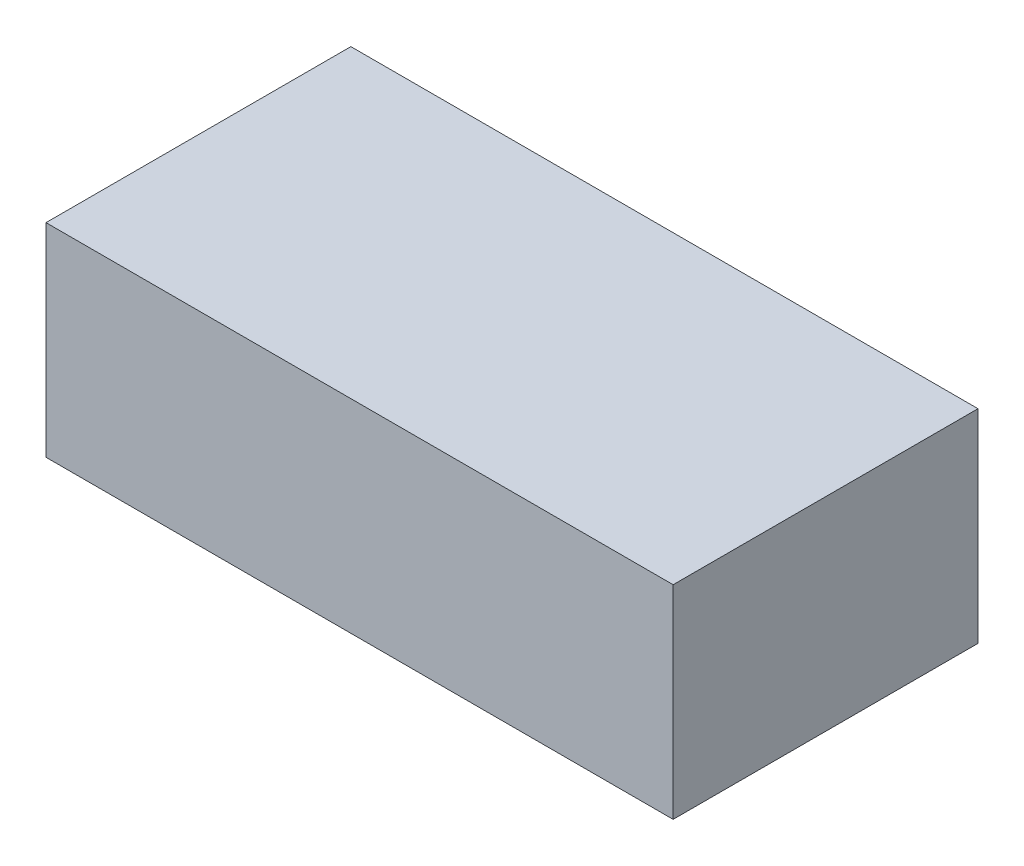
ISO-10303-21;
HEADER;
FILE_DESCRIPTION(('STEP AP214'),'2;1');
FILE_NAME('part.step','',(''),(''),'','','');
FILE_SCHEMA(('AUTOMOTIVE_DESIGN { 1 0 10303 214 1 1 1 1 }'));
ENDSEC;
DATA;
#1=APPLICATION_CONTEXT('core data for automotive mechanical design processes');
#2=APPLICATION_PROTOCOL_DEFINITION('international standard','automotive_design',2000,#1);
#3=PRODUCT_CONTEXT('',#1,'mechanical');
#4=PRODUCT('Part','Part','',(#3));
#5=PRODUCT_RELATED_PRODUCT_CATEGORY('part','',(#4));
#6=PRODUCT_DEFINITION_FORMATION('','',#4);
#7=PRODUCT_DEFINITION_CONTEXT('part definition',#1,'design');
#8=PRODUCT_DEFINITION('design','',#6,#7);
#9=PRODUCT_DEFINITION_SHAPE('','',#8);
#10=(LENGTH_UNIT() NAMED_UNIT(*) SI_UNIT(.MILLI.,.METRE.));
#11=(NAMED_UNIT(*) PLANE_ANGLE_UNIT() SI_UNIT($,.RADIAN.));
#12=(NAMED_UNIT(*) SI_UNIT($,.STERADIAN.) SOLID_ANGLE_UNIT());
#13=UNCERTAINTY_MEASURE_WITH_UNIT(LENGTH_MEASURE(1.E-05),#10,'distance_accuracy_value','');
#14=(GEOMETRIC_REPRESENTATION_CONTEXT(3) GLOBAL_UNCERTAINTY_ASSIGNED_CONTEXT((#13)) GLOBAL_UNIT_ASSIGNED_CONTEXT((#10,
#11,#12)) REPRESENTATION_CONTEXT('',''));
#15=CARTESIAN_POINT('',(0.,0.,0.));
#16=DIRECTION('',(0.,0.,1.));
#17=DIRECTION('',(1.,0.,0.));
#18=AXIS2_PLACEMENT_3D('',#15,#16,#17);
#19=CARTESIAN_POINT('',(35.,93.,-27.));
#20=DIRECTION('',(0.,1.,0.));
#21=DIRECTION('',(0.,0.,-1.));
#22=AXIS2_PLACEMENT_3D('',#19,#20,#21);
#23=PLANE('',#22);
#24=DIRECTION('',(1.,0.,0.));
#25=VECTOR('',#24,1.);
#26=CARTESIAN_POINT('',(13.4,93.,-16.5));
#27=LINE('',#26,#25);
#28=CARTESIAN_POINT('',(13.4,93.,-16.5));
#29=VERTEX_POINT('',#28);
#30=CARTESIAN_POINT('',(56.6,93.,-16.5));
#31=VERTEX_POINT('',#30);
#32=EDGE_CURVE('E85',#29,#31,#27,.T.);
#33=ORIENTED_EDGE('',*,*,#32,.T.);
#34=DIRECTION('',(0.,0.,-1.));
#35=VECTOR('',#34,1.);
#36=CARTESIAN_POINT('',(56.6,93.,-16.5));
#37=LINE('',#36,#35);
#38=CARTESIAN_POINT('',(56.6,93.,-37.5));
#39=VERTEX_POINT('',#38);
#40=EDGE_CURVE('E97',#31,#39,#37,.T.);
#41=ORIENTED_EDGE('',*,*,#40,.T.);
#42=DIRECTION('',(-1.,0.,0.));
#43=VECTOR('',#42,1.);
#44=CARTESIAN_POINT('',(56.6,93.,-37.5));
#45=LINE('',#44,#43);
#46=CARTESIAN_POINT('',(13.4,93.,-37.5));
#47=VERTEX_POINT('',#46);
#48=EDGE_CURVE('E74',#39,#47,#45,.T.);
#49=ORIENTED_EDGE('',*,*,#48,.T.);
#50=DIRECTION('',(0.,0.,1.));
#51=VECTOR('',#50,1.);
#52=CARTESIAN_POINT('',(13.4,93.,-37.5));
#53=LINE('',#52,#51);
#54=EDGE_CURVE('E11',#47,#29,#53,.T.);
#55=ORIENTED_EDGE('',*,*,#54,.T.);
#56=EDGE_LOOP('',(#33,#41,#49,#55));
#57=FACE_BOUND('',#56,.T.);
#58=ADVANCED_FACE('F17',(#57),#23,.T.);
#59=CARTESIAN_POINT('',(35.,79.,-27.));
#60=DIRECTION('',(0.,1.,0.));
#61=DIRECTION('',(0.,0.,-1.));
#62=AXIS2_PLACEMENT_3D('',#59,#60,#61);
#63=PLANE('',#62);
#64=DIRECTION('',(0.,0.,1.));
#65=VECTOR('',#64,1.);
#66=CARTESIAN_POINT('',(13.4,79.,-37.5));
#67=LINE('',#66,#65);
#68=CARTESIAN_POINT('',(13.4,79.,-37.5));
#69=VERTEX_POINT('',#68);
#70=CARTESIAN_POINT('',(13.4,79.,-16.5));
#71=VERTEX_POINT('',#70);
#72=EDGE_CURVE('E20',#69,#71,#67,.T.);
#73=ORIENTED_EDGE('',*,*,#72,.F.);
#74=DIRECTION('',(-1.,0.,0.));
#75=VECTOR('',#74,1.);
#76=CARTESIAN_POINT('',(56.6,79.,-37.5));
#77=LINE('',#76,#75);
#78=CARTESIAN_POINT('',(56.6,79.,-37.5));
#79=VERTEX_POINT('',#78);
#80=EDGE_CURVE('E105',#79,#69,#77,.T.);
#81=ORIENTED_EDGE('',*,*,#80,.F.);
#82=DIRECTION('',(0.,0.,-1.));
#83=VECTOR('',#82,1.);
#84=CARTESIAN_POINT('',(56.6,79.,-16.5));
#85=LINE('',#84,#83);
#86=CARTESIAN_POINT('',(56.6,79.,-16.5));
#87=VERTEX_POINT('',#86);
#88=EDGE_CURVE('E82',#87,#79,#85,.T.);
#89=ORIENTED_EDGE('',*,*,#88,.F.);
#90=DIRECTION('',(1.,0.,0.));
#91=VECTOR('',#90,1.);
#92=CARTESIAN_POINT('',(13.4,79.,-16.5));
#93=LINE('',#92,#91);
#94=EDGE_CURVE('E79',#71,#87,#93,.T.);
#95=ORIENTED_EDGE('',*,*,#94,.F.);
#96=EDGE_LOOP('',(#73,#81,#89,#95));
#97=FACE_BOUND('',#96,.T.);
#98=ADVANCED_FACE('F88',(#97),#63,.F.);
#99=CARTESIAN_POINT('',(13.4,79.,-37.5));
#100=DIRECTION('',(1.,0.,0.));
#101=DIRECTION('',(0.,1.,0.));
#102=AXIS2_PLACEMENT_3D('',#99,#100,#101);
#103=PLANE('',#102);
#104=ORIENTED_EDGE('',*,*,#72,.T.);
#105=DIRECTION('',(0.,1.,0.));
#106=VECTOR('',#105,1.);
#107=CARTESIAN_POINT('',(13.4,79.,-16.5));
#108=LINE('',#107,#106);
#109=EDGE_CURVE('E67',#71,#29,#108,.T.);
#110=ORIENTED_EDGE('',*,*,#109,.T.);
#111=ORIENTED_EDGE('',*,*,#54,.F.);
#112=DIRECTION('',(0.,1.,0.));
#113=VECTOR('',#112,1.);
#114=CARTESIAN_POINT('',(13.4,79.,-37.5));
#115=LINE('',#114,#113);
#116=EDGE_CURVE('E71',#69,#47,#115,.T.);
#117=ORIENTED_EDGE('',*,*,#116,.F.);
#118=EDGE_LOOP('',(#104,#110,#111,#117));
#119=FACE_BOUND('',#118,.T.);
#120=ADVANCED_FACE('F68',(#119),#103,.F.);
#121=CARTESIAN_POINT('',(56.6,79.,-37.5));
#122=DIRECTION('',(0.,0.,1.));
#123=DIRECTION('',(0.,-1.,0.));
#124=AXIS2_PLACEMENT_3D('',#121,#122,#123);
#125=PLANE('',#124);
#126=ORIENTED_EDGE('',*,*,#80,.T.);
#127=ORIENTED_EDGE('',*,*,#116,.T.);
#128=ORIENTED_EDGE('',*,*,#48,.F.);
#129=DIRECTION('',(0.,1.,0.));
#130=VECTOR('',#129,1.);
#131=CARTESIAN_POINT('',(56.6,79.,-37.5));
#132=LINE('',#131,#130);
#133=EDGE_CURVE('E103',#79,#39,#132,.T.);
#134=ORIENTED_EDGE('',*,*,#133,.F.);
#135=EDGE_LOOP('',(#126,#127,#128,#134));
#136=FACE_BOUND('',#135,.T.);
#137=ADVANCED_FACE('F118',(#136),#125,.F.);
#138=CARTESIAN_POINT('',(56.6,79.,-16.5));
#139=DIRECTION('',(-1.,0.,0.));
#140=DIRECTION('',(0.,0.,1.));
#141=AXIS2_PLACEMENT_3D('',#138,#139,#140);
#142=PLANE('',#141);
#143=ORIENTED_EDGE('',*,*,#88,.T.);
#144=ORIENTED_EDGE('',*,*,#133,.T.);
#145=ORIENTED_EDGE('',*,*,#40,.F.);
#146=DIRECTION('',(0.,1.,0.));
#147=VECTOR('',#146,1.);
#148=CARTESIAN_POINT('',(56.6,79.,-16.5));
#149=LINE('',#148,#147);
#150=EDGE_CURVE('E89',#87,#31,#149,.T.);
#151=ORIENTED_EDGE('',*,*,#150,.F.);
#152=EDGE_LOOP('',(#143,#144,#145,#151));
#153=FACE_BOUND('',#152,.T.);
#154=ADVANCED_FACE('F121',(#153),#142,.F.);
#155=CARTESIAN_POINT('',(13.4,79.,-16.5));
#156=DIRECTION('',(0.,0.,-1.));
#157=DIRECTION('',(-1.,0.,0.));
#158=AXIS2_PLACEMENT_3D('',#155,#156,#157);
#159=PLANE('',#158);
#160=ORIENTED_EDGE('',*,*,#94,.T.);
#161=ORIENTED_EDGE('',*,*,#150,.T.);
#162=ORIENTED_EDGE('',*,*,#32,.F.);
#163=ORIENTED_EDGE('',*,*,#109,.F.);
#164=EDGE_LOOP('',(#160,#161,#162,#163));
#165=FACE_BOUND('',#164,.T.);
#166=ADVANCED_FACE('F77',(#165),#159,.F.);
#167=CLOSED_SHELL('',(#58,#98,#120,#137,#154,#166));
#168=MANIFOLD_SOLID_BREP('B1',#167);
#169=ADVANCED_BREP_SHAPE_REPRESENTATION('',(#18,#168),#14);
#170=SHAPE_DEFINITION_REPRESENTATION(#9,#169);
ENDSEC;
END-ISO-10303-21;
